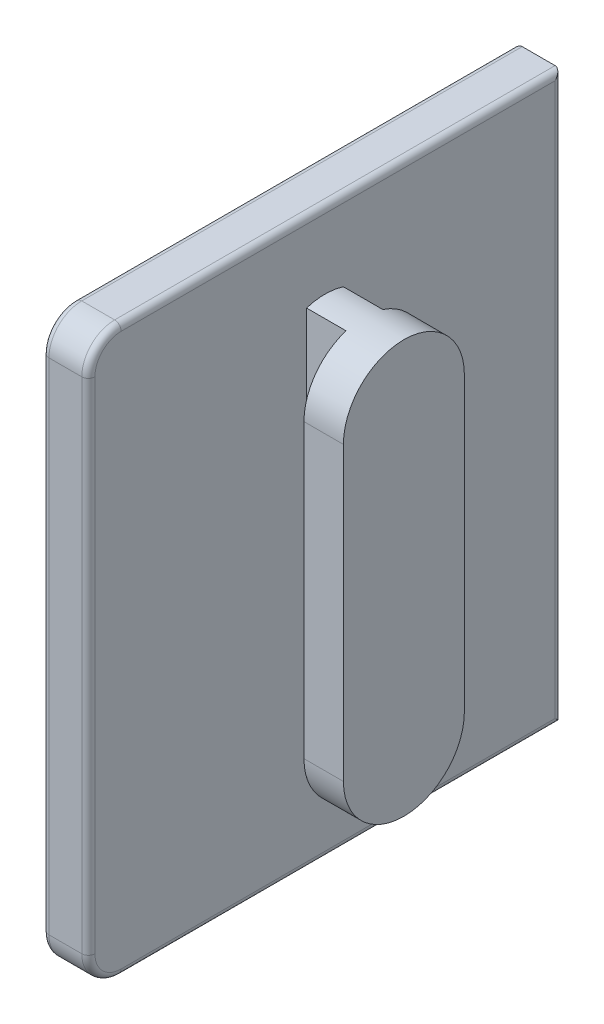
ISO-10303-21;
HEADER;
FILE_DESCRIPTION(('STEP AP214'),'2;1');
FILE_NAME('part.step','',(''),(''),'','','');
FILE_SCHEMA(('AUTOMOTIVE_DESIGN { 1 0 10303 214 1 1 1 1 }'));
ENDSEC;
DATA;
#1=APPLICATION_CONTEXT('core data for automotive mechanical design processes');
#2=APPLICATION_PROTOCOL_DEFINITION('international standard','automotive_design',2000,#1);
#3=PRODUCT_CONTEXT('',#1,'mechanical');
#4=PRODUCT('Part','Part','',(#3));
#5=PRODUCT_RELATED_PRODUCT_CATEGORY('part','',(#4));
#6=PRODUCT_DEFINITION_FORMATION('','',#4);
#7=PRODUCT_DEFINITION_CONTEXT('part definition',#1,'design');
#8=PRODUCT_DEFINITION('design','',#6,#7);
#9=PRODUCT_DEFINITION_SHAPE('','',#8);
#10=(LENGTH_UNIT() NAMED_UNIT(*) SI_UNIT(.MILLI.,.METRE.));
#11=(NAMED_UNIT(*) PLANE_ANGLE_UNIT() SI_UNIT($,.RADIAN.));
#12=(NAMED_UNIT(*) SI_UNIT($,.STERADIAN.) SOLID_ANGLE_UNIT());
#13=UNCERTAINTY_MEASURE_WITH_UNIT(LENGTH_MEASURE(1.E-05),#10,'distance_accuracy_value','');
#14=(GEOMETRIC_REPRESENTATION_CONTEXT(3) GLOBAL_UNCERTAINTY_ASSIGNED_CONTEXT((#13)) GLOBAL_UNIT_ASSIGNED_CONTEXT((#10,
#11,#12)) REPRESENTATION_CONTEXT('',''));
#15=CARTESIAN_POINT('',(0.,0.,0.));
#16=DIRECTION('',(0.,0.,1.));
#17=DIRECTION('',(1.,0.,0.));
#18=AXIS2_PLACEMENT_3D('',#15,#16,#17);
#19=CARTESIAN_POINT('',(3.5,0.,0.));
#20=DIRECTION('',(1.,0.,0.));
#21=DIRECTION('',(0.,0.,-1.));
#22=AXIS2_PLACEMENT_3D('',#19,#20,#21);
#23=PLANE('',#22);
#24=CARTESIAN_POINT('',(3.5,-19.,15.5));
#25=DIRECTION('',(1.,0.,0.));
#26=DIRECTION('',(0.,0.,-1.));
#27=AXIS2_PLACEMENT_3D('',#24,#25,#26);
#28=CIRCLE('',#27,2.);
#29=CARTESIAN_POINT('',(3.5,-19.,17.5));
#30=VERTEX_POINT('',#29);
#31=CARTESIAN_POINT('',(3.5,-21.,15.5));
#32=VERTEX_POINT('',#31);
#33=EDGE_CURVE('E455',#30,#32,#28,.T.);
#34=ORIENTED_EDGE('',*,*,#33,.T.);
#35=DIRECTION('',(0.,0.,-1.));
#36=VECTOR('',#35,1.);
#37=CARTESIAN_POINT('',(3.5,-21.,-18.));
#38=LINE('',#37,#36);
#39=CARTESIAN_POINT('',(3.5,-21.,-17.5));
#40=VERTEX_POINT('',#39);
#41=EDGE_CURVE('E452',#32,#40,#38,.T.);
#42=ORIENTED_EDGE('',*,*,#41,.T.);
#43=DIRECTION('',(0.,1.,0.));
#44=VECTOR('',#43,1.);
#45=CARTESIAN_POINT('',(3.5,21.5,-17.5));
#46=LINE('',#45,#44);
#47=CARTESIAN_POINT('',(3.5,21.,-17.5));
#48=VERTEX_POINT('',#47);
#49=EDGE_CURVE('E461',#40,#48,#46,.T.);
#50=ORIENTED_EDGE('',*,*,#49,.T.);
#51=DIRECTION('',(0.,0.,1.));
#52=VECTOR('',#51,1.);
#53=CARTESIAN_POINT('',(3.5,21.,15.5));
#54=LINE('',#53,#52);
#55=CARTESIAN_POINT('',(3.5,21.,15.5));
#56=VERTEX_POINT('',#55);
#57=EDGE_CURVE('E463',#48,#56,#54,.T.);
#58=ORIENTED_EDGE('',*,*,#57,.T.);
#59=CARTESIAN_POINT('',(3.5,19.,15.5));
#60=DIRECTION('',(1.,0.,0.));
#61=DIRECTION('',(0.,0.,-1.));
#62=AXIS2_PLACEMENT_3D('',#59,#60,#61);
#63=CIRCLE('',#62,2.);
#64=CARTESIAN_POINT('',(3.5,19.,17.5));
#65=VERTEX_POINT('',#64);
#66=EDGE_CURVE('E459',#56,#65,#63,.T.);
#67=ORIENTED_EDGE('',*,*,#66,.T.);
#68=DIRECTION('',(0.,-1.,0.));
#69=VECTOR('',#68,1.);
#70=CARTESIAN_POINT('',(3.5,-19.,17.5));
#71=LINE('',#70,#69);
#72=EDGE_CURVE('E457',#65,#30,#71,.T.);
#73=ORIENTED_EDGE('',*,*,#72,.T.);
#74=EDGE_LOOP('',(#34,#42,#50,#58,#67,#73));
#75=FACE_BOUND('',#74,.T.);
#76=DIRECTION('',(0.,1.,0.));
#77=VECTOR('',#76,1.);
#78=CARTESIAN_POINT('',(3.5,15.4817804600413,-1.4));
#79=LINE('',#78,#77);
#80=CARTESIAN_POINT('',(3.5,-15.4817804600413,-1.4));
#81=VERTEX_POINT('',#80);
#82=CARTESIAN_POINT('',(3.5,15.4817804600413,-1.4));
#83=VERTEX_POINT('',#82);
#84=EDGE_CURVE('E203',#81,#83,#79,.T.);
#85=ORIENTED_EDGE('',*,*,#84,.F.);
#86=CARTESIAN_POINT('',(3.5,-11.1,0.));
#87=DIRECTION('',(1.,0.,0.));
#88=DIRECTION('',(0.,0.,-1.));
#89=AXIS2_PLACEMENT_3D('',#86,#87,#88);
#90=CIRCLE('',#89,4.6);
#91=CARTESIAN_POINT('',(3.5,-15.4817804600413,1.4));
#92=VERTEX_POINT('',#91);
#93=EDGE_CURVE('E201',#92,#81,#90,.T.);
#94=ORIENTED_EDGE('',*,*,#93,.F.);
#95=DIRECTION('',(0.,-1.,0.));
#96=VECTOR('',#95,1.);
#97=CARTESIAN_POINT('',(3.5,15.4817804600413,1.4));
#98=LINE('',#97,#96);
#99=CARTESIAN_POINT('',(3.5,15.4817804600413,1.4));
#100=VERTEX_POINT('',#99);
#101=EDGE_CURVE('E257',#100,#92,#98,.T.);
#102=ORIENTED_EDGE('',*,*,#101,.F.);
#103=CARTESIAN_POINT('',(3.5,11.1,0.));
#104=DIRECTION('',(1.,0.,0.));
#105=DIRECTION('',(0.,0.,-1.));
#106=AXIS2_PLACEMENT_3D('',#103,#104,#105);
#107=CIRCLE('',#106,4.6);
#108=EDGE_CURVE('E260',#83,#100,#107,.T.);
#109=ORIENTED_EDGE('',*,*,#108,.F.);
#110=EDGE_LOOP('',(#85,#94,#102,#109));
#111=FACE_BOUND('',#110,.T.);
#112=ADVANCED_FACE('F36',(#75,#111),#23,.T.);
#113=CARTESIAN_POINT('',(3.5,21.5,-18.));
#114=DIRECTION('',(0.,0.,1.));
#115=DIRECTION('',(0.,-1.,0.));
#116=AXIS2_PLACEMENT_3D('',#113,#114,#115);
#117=PLANE('',#116);
#118=DIRECTION('',(-1.,0.,0.));
#119=VECTOR('',#118,1.);
#120=CARTESIAN_POINT('',(3.5,-21.5,-18.));
#121=LINE('',#120,#119);
#122=CARTESIAN_POINT('',(3.,-21.5,-18.));
#123=VERTEX_POINT('',#122);
#124=CARTESIAN_POINT('',(0.5,-21.5,-18.));
#125=VERTEX_POINT('',#124);
#126=EDGE_CURVE('E282',#123,#125,#121,.T.);
#127=ORIENTED_EDGE('',*,*,#126,.T.);
#128=DIRECTION('',(0.,1.,0.));
#129=VECTOR('',#128,1.);
#130=CARTESIAN_POINT('',(0.5,21.5,-18.));
#131=LINE('',#130,#129);
#132=CARTESIAN_POINT('',(0.5,21.5,-18.));
#133=VERTEX_POINT('',#132);
#134=EDGE_CURVE('E431',#125,#133,#131,.T.);
#135=ORIENTED_EDGE('',*,*,#134,.T.);
#136=DIRECTION('',(-1.,0.,0.));
#137=VECTOR('',#136,1.);
#138=CARTESIAN_POINT('',(3.5,21.5,-18.));
#139=LINE('',#138,#137);
#140=CARTESIAN_POINT('',(3.,21.5,-18.));
#141=VERTEX_POINT('',#140);
#142=EDGE_CURVE('E278',#141,#133,#139,.T.);
#143=ORIENTED_EDGE('',*,*,#142,.F.);
#144=DIRECTION('',(0.,1.,0.));
#145=VECTOR('',#144,1.);
#146=CARTESIAN_POINT('',(3.,-21.5,-18.));
#147=LINE('',#146,#145);
#148=EDGE_CURVE('E434',#141,#123,#147,.F.);
#149=ORIENTED_EDGE('',*,*,#148,.T.);
#150=EDGE_LOOP('',(#127,#135,#143,#149));
#151=FACE_BOUND('',#150,.T.);
#152=ADVANCED_FACE('F301',(#151),#117,.F.);
#153=CARTESIAN_POINT('',(3.5,21.5,18.));
#154=DIRECTION('',(0.,-1.,0.));
#155=DIRECTION('',(0.,0.,-1.));
#156=AXIS2_PLACEMENT_3D('',#153,#154,#155);
#157=PLANE('',#156);
#158=ORIENTED_EDGE('',*,*,#142,.T.);
#159=DIRECTION('',(0.,0.,1.));
#160=VECTOR('',#159,1.);
#161=CARTESIAN_POINT('',(0.5,21.5,18.));
#162=LINE('',#161,#160);
#163=CARTESIAN_POINT('',(0.5,21.5,15.5));
#164=VERTEX_POINT('',#163);
#165=EDGE_CURVE('E11',#133,#164,#162,.T.);
#166=ORIENTED_EDGE('',*,*,#165,.T.);
#167=DIRECTION('',(-1.,0.,0.));
#168=VECTOR('',#167,1.);
#169=CARTESIAN_POINT('',(3.5,21.5,15.5));
#170=LINE('',#169,#168);
#171=CARTESIAN_POINT('',(3.,21.5,15.5));
#172=VERTEX_POINT('',#171);
#173=EDGE_CURVE('E465',#164,#172,#170,.F.);
#174=ORIENTED_EDGE('',*,*,#173,.T.);
#175=DIRECTION('',(0.,0.,1.));
#176=VECTOR('',#175,1.);
#177=CARTESIAN_POINT('',(3.,21.5,-18.));
#178=LINE('',#177,#176);
#179=EDGE_CURVE('E45',#172,#141,#178,.F.);
#180=ORIENTED_EDGE('',*,*,#179,.T.);
#181=EDGE_LOOP('',(#158,#166,#174,#180));
#182=FACE_BOUND('',#181,.T.);
#183=ADVANCED_FACE('F307',(#182),#157,.F.);
#184=CARTESIAN_POINT('',(3.5,21.5,18.));
#185=DIRECTION('',(0.,0.,-1.));
#186=DIRECTION('',(0.,1.,0.));
#187=AXIS2_PLACEMENT_3D('',#184,#185,#186);
#188=PLANE('',#187);
#189=DIRECTION('',(-1.,0.,0.));
#190=VECTOR('',#189,1.);
#191=CARTESIAN_POINT('',(3.5,-19.,18.));
#192=LINE('',#191,#190);
#193=CARTESIAN_POINT('',(0.5,-19.,18.));
#194=VERTEX_POINT('',#193);
#195=CARTESIAN_POINT('',(3.,-19.,18.));
#196=VERTEX_POINT('',#195);
#197=EDGE_CURVE('E468',#194,#196,#192,.F.);
#198=ORIENTED_EDGE('',*,*,#197,.T.);
#199=DIRECTION('',(0.,-1.,0.));
#200=VECTOR('',#199,1.);
#201=CARTESIAN_POINT('',(3.,19.,18.));
#202=LINE('',#201,#200);
#203=CARTESIAN_POINT('',(3.,19.,18.));
#204=VERTEX_POINT('',#203);
#205=EDGE_CURVE('E440',#196,#204,#202,.F.);
#206=ORIENTED_EDGE('',*,*,#205,.T.);
#207=DIRECTION('',(-1.,0.,0.));
#208=VECTOR('',#207,1.);
#209=CARTESIAN_POINT('',(3.5,19.,18.));
#210=LINE('',#209,#208);
#211=CARTESIAN_POINT('',(0.5,19.,18.));
#212=VERTEX_POINT('',#211);
#213=EDGE_CURVE('E471',#204,#212,#210,.T.);
#214=ORIENTED_EDGE('',*,*,#213,.T.);
#215=DIRECTION('',(0.,-1.,0.));
#216=VECTOR('',#215,1.);
#217=CARTESIAN_POINT('',(0.5,21.5,18.));
#218=LINE('',#217,#216);
#219=EDGE_CURVE('E442',#212,#194,#218,.T.);
#220=ORIENTED_EDGE('',*,*,#219,.T.);
#221=EDGE_LOOP('',(#198,#206,#214,#220));
#222=FACE_BOUND('',#221,.T.);
#223=ADVANCED_FACE('F319',(#222),#188,.F.);
#224=CARTESIAN_POINT('',(3.5,-21.5,18.));
#225=DIRECTION('',(0.,1.,0.));
#226=DIRECTION('',(0.,0.,1.));
#227=AXIS2_PLACEMENT_3D('',#224,#225,#226);
#228=PLANE('',#227);
#229=ORIENTED_EDGE('',*,*,#126,.F.);
#230=DIRECTION('',(0.,0.,-1.));
#231=VECTOR('',#230,1.);
#232=CARTESIAN_POINT('',(3.,-21.5,15.5));
#233=LINE('',#232,#231);
#234=CARTESIAN_POINT('',(3.,-21.5,15.5));
#235=VERTEX_POINT('',#234);
#236=EDGE_CURVE('E447',#123,#235,#233,.F.);
#237=ORIENTED_EDGE('',*,*,#236,.T.);
#238=DIRECTION('',(-1.,0.,0.));
#239=VECTOR('',#238,1.);
#240=CARTESIAN_POINT('',(3.5,-21.5,15.5));
#241=LINE('',#240,#239);
#242=CARTESIAN_POINT('',(0.5,-21.5,15.5));
#243=VERTEX_POINT('',#242);
#244=EDGE_CURVE('E281',#235,#243,#241,.T.);
#245=ORIENTED_EDGE('',*,*,#244,.T.);
#246=DIRECTION('',(0.,0.,-1.));
#247=VECTOR('',#246,1.);
#248=CARTESIAN_POINT('',(0.5,-21.5,18.));
#249=LINE('',#248,#247);
#250=EDGE_CURVE('E450',#243,#125,#249,.T.);
#251=ORIENTED_EDGE('',*,*,#250,.T.);
#252=EDGE_LOOP('',(#229,#237,#245,#251));
#253=FACE_BOUND('',#252,.T.);
#254=ADVANCED_FACE('F316',(#253),#228,.F.);
#255=CARTESIAN_POINT('',(0.,0.,0.));
#256=DIRECTION('',(1.,0.,0.));
#257=DIRECTION('',(0.,0.,-1.));
#258=AXIS2_PLACEMENT_3D('',#255,#256,#257);
#259=PLANE('',#258);
#260=DIRECTION('',(0.,0.,1.));
#261=VECTOR('',#260,1.);
#262=CARTESIAN_POINT('',(0.,21.,0.));
#263=LINE('',#262,#261);
#264=CARTESIAN_POINT('',(0.,21.,15.5));
#265=VERTEX_POINT('',#264);
#266=CARTESIAN_POINT('',(0.,21.,-17.5));
#267=VERTEX_POINT('',#266);
#268=EDGE_CURVE('E53',#265,#267,#263,.F.);
#269=ORIENTED_EDGE('',*,*,#268,.T.);
#270=DIRECTION('',(0.,1.,0.));
#271=VECTOR('',#270,1.);
#272=CARTESIAN_POINT('',(0.,0.,-17.5));
#273=LINE('',#272,#271);
#274=CARTESIAN_POINT('',(0.,-21.,-17.5));
#275=VERTEX_POINT('',#274);
#276=EDGE_CURVE('E422',#267,#275,#273,.F.);
#277=ORIENTED_EDGE('',*,*,#276,.T.);
#278=DIRECTION('',(0.,0.,-1.));
#279=VECTOR('',#278,1.);
#280=CARTESIAN_POINT('',(0.,-21.,0.));
#281=LINE('',#280,#279);
#282=CARTESIAN_POINT('',(0.,-21.,15.5));
#283=VERTEX_POINT('',#282);
#284=EDGE_CURVE('E429',#275,#283,#281,.F.);
#285=ORIENTED_EDGE('',*,*,#284,.T.);
#286=CARTESIAN_POINT('',(0.,-19.,15.5));
#287=DIRECTION('',(1.,0.,0.));
#288=DIRECTION('',(0.,0.,-1.));
#289=AXIS2_PLACEMENT_3D('',#286,#287,#288);
#290=CIRCLE('',#289,2.);
#291=CARTESIAN_POINT('',(0.,-19.,17.5));
#292=VERTEX_POINT('',#291);
#293=EDGE_CURVE('E386',#283,#292,#290,.F.);
#294=ORIENTED_EDGE('',*,*,#293,.T.);
#295=DIRECTION('',(0.,-1.,0.));
#296=VECTOR('',#295,1.);
#297=CARTESIAN_POINT('',(0.,0.,17.5));
#298=LINE('',#297,#296);
#299=CARTESIAN_POINT('',(0.,19.,17.5));
#300=VERTEX_POINT('',#299);
#301=EDGE_CURVE('E426',#292,#300,#298,.F.);
#302=ORIENTED_EDGE('',*,*,#301,.T.);
#303=CARTESIAN_POINT('',(0.,19.,15.5));
#304=DIRECTION('',(1.,0.,0.));
#305=DIRECTION('',(0.,0.,-1.));
#306=AXIS2_PLACEMENT_3D('',#303,#304,#305);
#307=CIRCLE('',#306,2.);
#308=EDGE_CURVE('E58',#300,#265,#307,.F.);
#309=ORIENTED_EDGE('',*,*,#308,.T.);
#310=EDGE_LOOP('',(#269,#277,#285,#294,#302,#309));
#311=FACE_BOUND('',#310,.T.);
#312=ADVANCED_FACE('F313',(#311),#259,.F.);
#313=CARTESIAN_POINT('',(6.5,-11.1,0.));
#314=DIRECTION('',(-1.,0.,0.));
#315=DIRECTION('',(0.,0.,1.));
#316=AXIS2_PLACEMENT_3D('',#313,#314,#315);
#317=CYLINDRICAL_SURFACE('',#316,4.6);
#318=ORIENTED_EDGE('',*,*,#93,.T.);
#319=DIRECTION('',(-1.,0.,0.));
#320=VECTOR('',#319,1.);
#321=CARTESIAN_POINT('',(6.5,-15.4817804600413,-1.4));
#322=LINE('',#321,#320);
#323=CARTESIAN_POINT('',(6.5,-15.4817804600413,-1.4));
#324=VERTEX_POINT('',#323);
#325=EDGE_CURVE('E276',#324,#81,#322,.T.);
#326=ORIENTED_EDGE('',*,*,#325,.F.);
#327=CARTESIAN_POINT('',(6.5,-11.1,0.));
#328=DIRECTION('',(1.,0.,0.));
#329=DIRECTION('',(0.,0.,-1.));
#330=AXIS2_PLACEMENT_3D('',#327,#328,#329);
#331=CIRCLE('',#330,4.6);
#332=CARTESIAN_POINT('',(6.5,-11.1,-4.6));
#333=VERTEX_POINT('',#332);
#334=EDGE_CURVE('E199',#324,#333,#331,.T.);
#335=ORIENTED_EDGE('',*,*,#334,.T.);
#336=DIRECTION('',(-1.,0.,0.));
#337=VECTOR('',#336,1.);
#338=CARTESIAN_POINT('',(9.5,-11.1,-4.6));
#339=LINE('',#338,#337);
#340=CARTESIAN_POINT('',(9.5,-11.1,-4.6));
#341=VERTEX_POINT('',#340);
#342=EDGE_CURVE('E178',#341,#333,#339,.T.);
#343=ORIENTED_EDGE('',*,*,#342,.F.);
#344=CARTESIAN_POINT('',(9.5,-11.1,0.));
#345=DIRECTION('',(1.,0.,0.));
#346=DIRECTION('',(0.,0.,-1.));
#347=AXIS2_PLACEMENT_3D('',#344,#345,#346);
#348=CIRCLE('',#347,4.6);
#349=CARTESIAN_POINT('',(9.5,-11.1,4.59999999999999));
#350=VERTEX_POINT('',#349);
#351=EDGE_CURVE('E184',#350,#341,#348,.T.);
#352=ORIENTED_EDGE('',*,*,#351,.F.);
#353=DIRECTION('',(-1.,0.,0.));
#354=VECTOR('',#353,1.);
#355=CARTESIAN_POINT('',(9.5,-11.1,4.59999999999999));
#356=LINE('',#355,#354);
#357=CARTESIAN_POINT('',(6.5,-11.1,4.59999999999999));
#358=VERTEX_POINT('',#357);
#359=EDGE_CURVE('E245',#350,#358,#356,.T.);
#360=ORIENTED_EDGE('',*,*,#359,.T.);
#361=CARTESIAN_POINT('',(6.5,-15.4817804600413,1.4));
#362=VERTEX_POINT('',#361);
#363=EDGE_CURVE('E209',#358,#362,#331,.T.);
#364=ORIENTED_EDGE('',*,*,#363,.T.);
#365=DIRECTION('',(-1.,0.,0.));
#366=VECTOR('',#365,1.);
#367=CARTESIAN_POINT('',(6.5,-15.4817804600413,1.4));
#368=LINE('',#367,#366);
#369=EDGE_CURVE('E250',#362,#92,#368,.T.);
#370=ORIENTED_EDGE('',*,*,#369,.T.);
#371=EDGE_LOOP('',(#318,#326,#335,#343,#352,#360,#364,#370));
#372=FACE_BOUND('',#371,.T.);
#373=ADVANCED_FACE('F196',(#372),#317,.T.);
#374=CARTESIAN_POINT('',(6.5,15.4817804600413,-1.4));
#375=DIRECTION('',(0.,0.,1.));
#376=DIRECTION('',(0.,-1.,0.));
#377=AXIS2_PLACEMENT_3D('',#374,#375,#376);
#378=PLANE('',#377);
#379=ORIENTED_EDGE('',*,*,#84,.T.);
#380=DIRECTION('',(-1.,0.,0.));
#381=VECTOR('',#380,1.);
#382=CARTESIAN_POINT('',(6.5,15.4817804600413,-1.4));
#383=LINE('',#382,#381);
#384=CARTESIAN_POINT('',(6.5,15.4817804600413,-1.4));
#385=VERTEX_POINT('',#384);
#386=EDGE_CURVE('E266',#385,#83,#383,.T.);
#387=ORIENTED_EDGE('',*,*,#386,.F.);
#388=DIRECTION('',(0.,1.,0.));
#389=VECTOR('',#388,1.);
#390=CARTESIAN_POINT('',(6.5,15.4817804600413,-1.4));
#391=LINE('',#390,#389);
#392=EDGE_CURVE('E255',#324,#385,#391,.T.);
#393=ORIENTED_EDGE('',*,*,#392,.F.);
#394=ORIENTED_EDGE('',*,*,#325,.T.);
#395=EDGE_LOOP('',(#379,#387,#393,#394));
#396=FACE_BOUND('',#395,.T.);
#397=ADVANCED_FACE('F286',(#396),#378,.F.);
#398=CARTESIAN_POINT('',(6.5,11.1,0.));
#399=DIRECTION('',(-1.,0.,0.));
#400=DIRECTION('',(0.,0.,1.));
#401=AXIS2_PLACEMENT_3D('',#398,#399,#400);
#402=CYLINDRICAL_SURFACE('',#401,4.6);
#403=ORIENTED_EDGE('',*,*,#108,.T.);
#404=DIRECTION('',(-1.,0.,0.));
#405=VECTOR('',#404,1.);
#406=CARTESIAN_POINT('',(6.5,15.4817804600413,1.4));
#407=LINE('',#406,#405);
#408=CARTESIAN_POINT('',(6.5,15.4817804600413,1.4));
#409=VERTEX_POINT('',#408);
#410=EDGE_CURVE('E238',#409,#100,#407,.T.);
#411=ORIENTED_EDGE('',*,*,#410,.F.);
#412=CARTESIAN_POINT('',(6.5,11.1,0.));
#413=DIRECTION('',(1.,0.,0.));
#414=DIRECTION('',(0.,0.,-1.));
#415=AXIS2_PLACEMENT_3D('',#412,#413,#414);
#416=CIRCLE('',#415,4.6);
#417=CARTESIAN_POINT('',(6.5,11.1,4.6));
#418=VERTEX_POINT('',#417);
#419=EDGE_CURVE('E221',#409,#418,#416,.T.);
#420=ORIENTED_EDGE('',*,*,#419,.T.);
#421=DIRECTION('',(-1.,0.,0.));
#422=VECTOR('',#421,1.);
#423=CARTESIAN_POINT('',(9.5,11.1,4.6));
#424=LINE('',#423,#422);
#425=CARTESIAN_POINT('',(9.5,11.1,4.6));
#426=VERTEX_POINT('',#425);
#427=EDGE_CURVE('E205',#426,#418,#424,.T.);
#428=ORIENTED_EDGE('',*,*,#427,.F.);
#429=CARTESIAN_POINT('',(9.5,11.1,0.));
#430=DIRECTION('',(1.,0.,0.));
#431=DIRECTION('',(0.,0.,-1.));
#432=AXIS2_PLACEMENT_3D('',#429,#430,#431);
#433=CIRCLE('',#432,4.6);
#434=CARTESIAN_POINT('',(9.5,11.1,-4.6));
#435=VERTEX_POINT('',#434);
#436=EDGE_CURVE('E183',#435,#426,#433,.T.);
#437=ORIENTED_EDGE('',*,*,#436,.F.);
#438=DIRECTION('',(-1.,0.,0.));
#439=VECTOR('',#438,1.);
#440=CARTESIAN_POINT('',(9.5,11.1,-4.6));
#441=LINE('',#440,#439);
#442=CARTESIAN_POINT('',(6.5,11.1,-4.6));
#443=VERTEX_POINT('',#442);
#444=EDGE_CURVE('E180',#435,#443,#441,.T.);
#445=ORIENTED_EDGE('',*,*,#444,.T.);
#446=EDGE_CURVE('E228',#443,#385,#416,.T.);
#447=ORIENTED_EDGE('',*,*,#446,.T.);
#448=ORIENTED_EDGE('',*,*,#386,.T.);
#449=EDGE_LOOP('',(#403,#411,#420,#428,#437,#445,#447,#448));
#450=FACE_BOUND('',#449,.T.);
#451=ADVANCED_FACE('F237',(#450),#402,.T.);
#452=CARTESIAN_POINT('',(6.5,15.4817804600413,1.4));
#453=DIRECTION('',(0.,0.,-1.));
#454=DIRECTION('',(0.,1.,0.));
#455=AXIS2_PLACEMENT_3D('',#452,#453,#454);
#456=PLANE('',#455);
#457=ORIENTED_EDGE('',*,*,#101,.T.);
#458=ORIENTED_EDGE('',*,*,#369,.F.);
#459=DIRECTION('',(0.,-1.,0.));
#460=VECTOR('',#459,1.);
#461=CARTESIAN_POINT('',(6.5,15.4817804600413,1.4));
#462=LINE('',#461,#460);
#463=EDGE_CURVE('E248',#409,#362,#462,.T.);
#464=ORIENTED_EDGE('',*,*,#463,.F.);
#465=ORIENTED_EDGE('',*,*,#410,.T.);
#466=EDGE_LOOP('',(#457,#458,#464,#465));
#467=FACE_BOUND('',#466,.T.);
#468=ADVANCED_FACE('F290',(#467),#456,.F.);
#469=CARTESIAN_POINT('',(6.5,-11.1,0.));
#470=DIRECTION('',(1.,0.,0.));
#471=DIRECTION('',(0.,0.,-1.));
#472=AXIS2_PLACEMENT_3D('',#469,#470,#471);
#473=PLANE('',#472);
#474=ORIENTED_EDGE('',*,*,#334,.F.);
#475=ORIENTED_EDGE('',*,*,#392,.T.);
#476=ORIENTED_EDGE('',*,*,#446,.F.);
#477=DIRECTION('',(0.,1.,0.));
#478=VECTOR('',#477,1.);
#479=CARTESIAN_POINT('',(6.5,11.1,-4.6));
#480=LINE('',#479,#478);
#481=EDGE_CURVE('E213',#333,#443,#480,.T.);
#482=ORIENTED_EDGE('',*,*,#481,.F.);
#483=EDGE_LOOP('',(#474,#475,#476,#482));
#484=FACE_BOUND('',#483,.T.);
#485=ADVANCED_FACE('F254',(#484),#473,.F.);
#486=ORIENTED_EDGE('',*,*,#419,.F.);
#487=ORIENTED_EDGE('',*,*,#463,.T.);
#488=ORIENTED_EDGE('',*,*,#363,.F.);
#489=DIRECTION('',(0.,-1.,0.));
#490=VECTOR('',#489,1.);
#491=CARTESIAN_POINT('',(6.5,-11.1,4.59999999999999));
#492=LINE('',#491,#490);
#493=EDGE_CURVE('E193',#418,#358,#492,.T.);
#494=ORIENTED_EDGE('',*,*,#493,.F.);
#495=EDGE_LOOP('',(#486,#487,#488,#494));
#496=FACE_BOUND('',#495,.T.);
#497=ADVANCED_FACE('F247',(#496),#473,.F.);
#498=CARTESIAN_POINT('',(9.5,11.1,-4.6));
#499=DIRECTION('',(0.,0.,1.));
#500=DIRECTION('',(0.,-1.,0.));
#501=AXIS2_PLACEMENT_3D('',#498,#499,#500);
#502=PLANE('',#501);
#503=ORIENTED_EDGE('',*,*,#481,.T.);
#504=ORIENTED_EDGE('',*,*,#444,.F.);
#505=DIRECTION('',(0.,1.,0.));
#506=VECTOR('',#505,1.);
#507=CARTESIAN_POINT('',(9.5,11.1,-4.6));
#508=LINE('',#507,#506);
#509=EDGE_CURVE('E174',#341,#435,#508,.T.);
#510=ORIENTED_EDGE('',*,*,#509,.F.);
#511=ORIENTED_EDGE('',*,*,#342,.T.);
#512=EDGE_LOOP('',(#503,#504,#510,#511));
#513=FACE_BOUND('',#512,.T.);
#514=ADVANCED_FACE('F176',(#513),#502,.F.);
#515=CARTESIAN_POINT('',(9.5,-11.1,4.59999999999999));
#516=DIRECTION('',(0.,0.,-1.));
#517=DIRECTION('',(0.,1.,0.));
#518=AXIS2_PLACEMENT_3D('',#515,#516,#517);
#519=PLANE('',#518);
#520=ORIENTED_EDGE('',*,*,#493,.T.);
#521=ORIENTED_EDGE('',*,*,#359,.F.);
#522=DIRECTION('',(0.,-1.,0.));
#523=VECTOR('',#522,1.);
#524=CARTESIAN_POINT('',(9.5,-11.1,4.59999999999999));
#525=LINE('',#524,#523);
#526=EDGE_CURVE('E189',#426,#350,#525,.T.);
#527=ORIENTED_EDGE('',*,*,#526,.F.);
#528=ORIENTED_EDGE('',*,*,#427,.T.);
#529=EDGE_LOOP('',(#520,#521,#527,#528));
#530=FACE_BOUND('',#529,.T.);
#531=ADVANCED_FACE('F244',(#530),#519,.F.);
#532=CARTESIAN_POINT('',(9.5,-11.1,0.));
#533=DIRECTION('',(1.,0.,0.));
#534=DIRECTION('',(0.,0.,-1.));
#535=AXIS2_PLACEMENT_3D('',#532,#533,#534);
#536=PLANE('',#535);
#537=ORIENTED_EDGE('',*,*,#351,.T.);
#538=ORIENTED_EDGE('',*,*,#509,.T.);
#539=ORIENTED_EDGE('',*,*,#436,.T.);
#540=ORIENTED_EDGE('',*,*,#526,.T.);
#541=EDGE_LOOP('',(#537,#538,#539,#540));
#542=FACE_BOUND('',#541,.T.);
#543=ADVANCED_FACE('F187',(#542),#536,.T.);
#544=CARTESIAN_POINT('',(3.5,-19.,15.5));
#545=DIRECTION('',(-1.,0.,0.));
#546=DIRECTION('',(0.,0.,1.));
#547=AXIS2_PLACEMENT_3D('',#544,#545,#546);
#548=CYLINDRICAL_SURFACE('',#547,2.5);
#549=ORIENTED_EDGE('',*,*,#244,.F.);
#550=CARTESIAN_POINT('',(3.,-19.,15.5));
#551=DIRECTION('',(1.,0.,0.));
#552=DIRECTION('',(0.,0.,-1.));
#553=AXIS2_PLACEMENT_3D('',#550,#551,#552);
#554=CIRCLE('',#553,2.5);
#555=EDGE_CURVE('E444',#235,#196,#554,.F.);
#556=ORIENTED_EDGE('',*,*,#555,.T.);
#557=ORIENTED_EDGE('',*,*,#197,.F.);
#558=CARTESIAN_POINT('',(0.5,-19.,15.5));
#559=DIRECTION('',(1.,0.,0.));
#560=DIRECTION('',(0.,0.,-1.));
#561=AXIS2_PLACEMENT_3D('',#558,#559,#560);
#562=CIRCLE('',#561,2.5);
#563=EDGE_CURVE('E388',#194,#243,#562,.T.);
#564=ORIENTED_EDGE('',*,*,#563,.T.);
#565=EDGE_LOOP('',(#549,#556,#557,#564));
#566=FACE_BOUND('',#565,.T.);
#567=ADVANCED_FACE('F327',(#566),#548,.T.);
#568=CARTESIAN_POINT('',(3.5,19.,15.5));
#569=DIRECTION('',(-1.,0.,0.));
#570=DIRECTION('',(0.,0.,1.));
#571=AXIS2_PLACEMENT_3D('',#568,#569,#570);
#572=CYLINDRICAL_SURFACE('',#571,2.5);
#573=ORIENTED_EDGE('',*,*,#213,.F.);
#574=CARTESIAN_POINT('',(3.,19.,15.5));
#575=DIRECTION('',(1.,0.,0.));
#576=DIRECTION('',(0.,0.,-1.));
#577=AXIS2_PLACEMENT_3D('',#574,#575,#576);
#578=CIRCLE('',#577,2.5);
#579=EDGE_CURVE('E436',#204,#172,#578,.F.);
#580=ORIENTED_EDGE('',*,*,#579,.T.);
#581=ORIENTED_EDGE('',*,*,#173,.F.);
#582=CARTESIAN_POINT('',(0.5,19.,15.5));
#583=DIRECTION('',(1.,0.,0.));
#584=DIRECTION('',(0.,0.,-1.));
#585=AXIS2_PLACEMENT_3D('',#582,#583,#584);
#586=CIRCLE('',#585,2.5);
#587=EDGE_CURVE('E438',#164,#212,#586,.T.);
#588=ORIENTED_EDGE('',*,*,#587,.T.);
#589=EDGE_LOOP('',(#573,#580,#581,#588));
#590=FACE_BOUND('',#589,.T.);
#591=ADVANCED_FACE('F330',(#590),#572,.T.);
#592=CARTESIAN_POINT('',(3.,19.,15.5));
#593=DIRECTION('',(1.,0.,0.));
#594=DIRECTION('',(0.,0.,-1.));
#595=AXIS2_PLACEMENT_3D('',#592,#593,#594);
#596=TOROIDAL_SURFACE('',#595,2.,0.5);
#597=CARTESIAN_POINT('',(3.,21.,15.5));
#598=DIRECTION('',(0.,0.,-1.));
#599=DIRECTION('',(-1.,0.,0.));
#600=AXIS2_PLACEMENT_3D('',#597,#598,#599);
#601=CIRCLE('',#600,0.5);
#602=EDGE_CURVE('E411',#172,#56,#601,.T.);
#603=ORIENTED_EDGE('',*,*,#602,.F.);
#604=ORIENTED_EDGE('',*,*,#579,.F.);
#605=CARTESIAN_POINT('',(3.,19.,17.5));
#606=DIRECTION('',(0.,-1.,0.));
#607=DIRECTION('',(0.,0.,-1.));
#608=AXIS2_PLACEMENT_3D('',#605,#606,#607);
#609=CIRCLE('',#608,0.5);
#610=EDGE_CURVE('E408',#65,#204,#609,.T.);
#611=ORIENTED_EDGE('',*,*,#610,.F.);
#612=ORIENTED_EDGE('',*,*,#66,.F.);
#613=EDGE_LOOP('',(#603,#604,#611,#612));
#614=FACE_BOUND('',#613,.T.);
#615=ADVANCED_FACE('F334',(#614),#596,.T.);
#616=CARTESIAN_POINT('',(3.,0.,17.5));
#617=DIRECTION('',(0.,1.,0.));
#618=DIRECTION('',(0.,0.,1.));
#619=AXIS2_PLACEMENT_3D('',#616,#617,#618);
#620=CYLINDRICAL_SURFACE('',#619,0.5);
#621=ORIENTED_EDGE('',*,*,#610,.T.);
#622=ORIENTED_EDGE('',*,*,#205,.F.);
#623=CARTESIAN_POINT('',(3.,-19.,17.5));
#624=DIRECTION('',(0.,-1.,0.));
#625=DIRECTION('',(0.,0.,-1.));
#626=AXIS2_PLACEMENT_3D('',#623,#624,#625);
#627=CIRCLE('',#626,0.5);
#628=EDGE_CURVE('E414',#30,#196,#627,.T.);
#629=ORIENTED_EDGE('',*,*,#628,.F.);
#630=ORIENTED_EDGE('',*,*,#72,.F.);
#631=EDGE_LOOP('',(#621,#622,#629,#630));
#632=FACE_BOUND('',#631,.T.);
#633=ADVANCED_FACE('F351',(#632),#620,.T.);
#634=CARTESIAN_POINT('',(3.,21.,0.));
#635=DIRECTION('',(0.,0.,-1.));
#636=DIRECTION('',(-1.,0.,0.));
#637=AXIS2_PLACEMENT_3D('',#634,#635,#636);
#638=CYLINDRICAL_SURFACE('',#637,0.5);
#639=ORIENTED_EDGE('',*,*,#602,.T.);
#640=ORIENTED_EDGE('',*,*,#57,.F.);
#641=CARTESIAN_POINT('',(3.,21.,-17.5));
#642=DIRECTION('',(0.,-0.707106781186547,-0.707106781186548));
#643=DIRECTION('',(0.,0.707106781186548,-0.707106781186547));
#644=AXIS2_PLACEMENT_3D('',#641,#642,#643);
#645=ELLIPSE('',#644,0.707106781186547,0.5);
#646=EDGE_CURVE('E417',#141,#48,#645,.T.);
#647=ORIENTED_EDGE('',*,*,#646,.F.);
#648=ORIENTED_EDGE('',*,*,#179,.F.);
#649=EDGE_LOOP('',(#639,#640,#647,#648));
#650=FACE_BOUND('',#649,.T.);
#651=ADVANCED_FACE('F347',(#650),#638,.T.);
#652=CARTESIAN_POINT('',(3.,-19.,15.5));
#653=DIRECTION('',(1.,0.,0.));
#654=DIRECTION('',(0.,0.,-1.));
#655=AXIS2_PLACEMENT_3D('',#652,#653,#654);
#656=TOROIDAL_SURFACE('',#655,2.,0.5);
#657=ORIENTED_EDGE('',*,*,#628,.T.);
#658=ORIENTED_EDGE('',*,*,#555,.F.);
#659=CARTESIAN_POINT('',(3.,-21.,15.5));
#660=DIRECTION('',(0.,0.,-1.));
#661=DIRECTION('',(-1.,0.,0.));
#662=AXIS2_PLACEMENT_3D('',#659,#660,#661);
#663=CIRCLE('',#662,0.5);
#664=EDGE_CURVE('E393',#32,#235,#663,.T.);
#665=ORIENTED_EDGE('',*,*,#664,.F.);
#666=ORIENTED_EDGE('',*,*,#33,.F.);
#667=EDGE_LOOP('',(#657,#658,#665,#666));
#668=FACE_BOUND('',#667,.T.);
#669=ADVANCED_FACE('F343',(#668),#656,.T.);
#670=CARTESIAN_POINT('',(3.,0.,-17.5));
#671=DIRECTION('',(0.,-1.,0.));
#672=DIRECTION('',(0.,0.,-1.));
#673=AXIS2_PLACEMENT_3D('',#670,#671,#672);
#674=CYLINDRICAL_SURFACE('',#673,0.5);
#675=ORIENTED_EDGE('',*,*,#646,.T.);
#676=ORIENTED_EDGE('',*,*,#49,.F.);
#677=CARTESIAN_POINT('',(3.,-21.,-17.5));
#678=DIRECTION('',(0.,-0.707106781186548,0.707106781186547));
#679=DIRECTION('',(0.,-0.707106781186547,-0.707106781186548));
#680=AXIS2_PLACEMENT_3D('',#677,#678,#679);
#681=ELLIPSE('',#680,0.707106781186548,0.5);
#682=EDGE_CURVE('E391',#123,#40,#681,.T.);
#683=ORIENTED_EDGE('',*,*,#682,.F.);
#684=ORIENTED_EDGE('',*,*,#148,.F.);
#685=EDGE_LOOP('',(#675,#676,#683,#684));
#686=FACE_BOUND('',#685,.T.);
#687=ADVANCED_FACE('F339',(#686),#674,.T.);
#688=CARTESIAN_POINT('',(3.,-21.,0.));
#689=DIRECTION('',(0.,0.,1.));
#690=DIRECTION('',(1.,0.,0.));
#691=AXIS2_PLACEMENT_3D('',#688,#689,#690);
#692=CYLINDRICAL_SURFACE('',#691,0.5);
#693=ORIENTED_EDGE('',*,*,#664,.T.);
#694=ORIENTED_EDGE('',*,*,#236,.F.);
#695=ORIENTED_EDGE('',*,*,#682,.T.);
#696=ORIENTED_EDGE('',*,*,#41,.F.);
#697=EDGE_LOOP('',(#693,#694,#695,#696));
#698=FACE_BOUND('',#697,.T.);
#699=ADVANCED_FACE('F336',(#698),#692,.T.);
#700=CARTESIAN_POINT('',(0.5,21.5,17.5));
#701=DIRECTION('',(0.,-1.,0.));
#702=DIRECTION('',(0.,0.,-1.));
#703=AXIS2_PLACEMENT_3D('',#700,#701,#702);
#704=CYLINDRICAL_SURFACE('',#703,0.5);
#705=CARTESIAN_POINT('',(0.5,19.,17.5));
#706=DIRECTION('',(0.,1.,0.));
#707=DIRECTION('',(0.,0.,1.));
#708=AXIS2_PLACEMENT_3D('',#705,#706,#707);
#709=CIRCLE('',#708,0.5);
#710=EDGE_CURVE('E392',#300,#212,#709,.T.);
#711=ORIENTED_EDGE('',*,*,#710,.F.);
#712=ORIENTED_EDGE('',*,*,#301,.F.);
#713=CARTESIAN_POINT('',(0.5,-19.,17.5));
#714=DIRECTION('',(0.,-1.,0.));
#715=DIRECTION('',(0.,0.,-1.));
#716=AXIS2_PLACEMENT_3D('',#713,#714,#715);
#717=CIRCLE('',#716,0.5);
#718=EDGE_CURVE('E40',#194,#292,#717,.T.);
#719=ORIENTED_EDGE('',*,*,#718,.F.);
#720=ORIENTED_EDGE('',*,*,#219,.F.);
#721=EDGE_LOOP('',(#711,#712,#719,#720));
#722=FACE_BOUND('',#721,.T.);
#723=ADVANCED_FACE('F38',(#722),#704,.T.);
#724=CARTESIAN_POINT('',(0.5,-19.,15.5));
#725=DIRECTION('',(1.,0.,0.));
#726=DIRECTION('',(0.,0.,-1.));
#727=AXIS2_PLACEMENT_3D('',#724,#725,#726);
#728=TOROIDAL_SURFACE('',#727,2.,0.5);
#729=ORIENTED_EDGE('',*,*,#718,.T.);
#730=ORIENTED_EDGE('',*,*,#293,.F.);
#731=CARTESIAN_POINT('',(0.5,-21.,15.5));
#732=DIRECTION('',(0.,0.,-1.));
#733=DIRECTION('',(-1.,0.,0.));
#734=AXIS2_PLACEMENT_3D('',#731,#732,#733);
#735=CIRCLE('',#734,0.5);
#736=EDGE_CURVE('E396',#243,#283,#735,.T.);
#737=ORIENTED_EDGE('',*,*,#736,.F.);
#738=ORIENTED_EDGE('',*,*,#563,.F.);
#739=EDGE_LOOP('',(#729,#730,#737,#738));
#740=FACE_BOUND('',#739,.T.);
#741=ADVANCED_FACE('F373',(#740),#728,.T.);
#742=CARTESIAN_POINT('',(0.5,19.,15.5));
#743=DIRECTION('',(1.,0.,0.));
#744=DIRECTION('',(0.,0.,-1.));
#745=AXIS2_PLACEMENT_3D('',#742,#743,#744);
#746=TOROIDAL_SURFACE('',#745,2.,0.5);
#747=ORIENTED_EDGE('',*,*,#710,.T.);
#748=ORIENTED_EDGE('',*,*,#587,.F.);
#749=CARTESIAN_POINT('',(0.5,21.,15.5));
#750=DIRECTION('',(0.,0.,-1.));
#751=DIRECTION('',(-1.,0.,0.));
#752=AXIS2_PLACEMENT_3D('',#749,#750,#751);
#753=CIRCLE('',#752,0.5);
#754=EDGE_CURVE('E399',#265,#164,#753,.T.);
#755=ORIENTED_EDGE('',*,*,#754,.F.);
#756=ORIENTED_EDGE('',*,*,#308,.F.);
#757=EDGE_LOOP('',(#747,#748,#755,#756));
#758=FACE_BOUND('',#757,.T.);
#759=ADVANCED_FACE('F370',(#758),#746,.T.);
#760=CARTESIAN_POINT('',(0.5,-21.,18.));
#761=DIRECTION('',(0.,0.,-1.));
#762=DIRECTION('',(-1.,0.,0.));
#763=AXIS2_PLACEMENT_3D('',#760,#761,#762);
#764=CYLINDRICAL_SURFACE('',#763,0.5);
#765=ORIENTED_EDGE('',*,*,#736,.T.);
#766=ORIENTED_EDGE('',*,*,#284,.F.);
#767=CARTESIAN_POINT('',(0.5,-21.,-17.5));
#768=DIRECTION('',(0.,0.707106781186548,-0.707106781186547));
#769=DIRECTION('',(0.,-0.707106781186547,-0.707106781186548));
#770=AXIS2_PLACEMENT_3D('',#767,#768,#769);
#771=ELLIPSE('',#770,0.707106781186548,0.5);
#772=EDGE_CURVE('E404',#125,#275,#771,.T.);
#773=ORIENTED_EDGE('',*,*,#772,.F.);
#774=ORIENTED_EDGE('',*,*,#250,.F.);
#775=EDGE_LOOP('',(#765,#766,#773,#774));
#776=FACE_BOUND('',#775,.T.);
#777=ADVANCED_FACE('F366',(#776),#764,.T.);
#778=CARTESIAN_POINT('',(0.5,21.,18.));
#779=DIRECTION('',(0.,0.,1.));
#780=DIRECTION('',(1.,0.,0.));
#781=AXIS2_PLACEMENT_3D('',#778,#779,#780);
#782=CYLINDRICAL_SURFACE('',#781,0.5);
#783=ORIENTED_EDGE('',*,*,#754,.T.);
#784=ORIENTED_EDGE('',*,*,#165,.F.);
#785=CARTESIAN_POINT('',(0.5,21.,-17.5));
#786=DIRECTION('',(0.,0.707106781186547,0.707106781186548));
#787=DIRECTION('',(0.,-0.707106781186548,0.707106781186547));
#788=AXIS2_PLACEMENT_3D('',#785,#786,#787);
#789=ELLIPSE('',#788,0.707106781186547,0.5);
#790=EDGE_CURVE('E406',#267,#133,#789,.F.);
#791=ORIENTED_EDGE('',*,*,#790,.F.);
#792=ORIENTED_EDGE('',*,*,#268,.F.);
#793=EDGE_LOOP('',(#783,#784,#791,#792));
#794=FACE_BOUND('',#793,.T.);
#795=ADVANCED_FACE('F362',(#794),#782,.T.);
#796=CARTESIAN_POINT('',(0.5,21.5,-17.5));
#797=DIRECTION('',(0.,1.,0.));
#798=DIRECTION('',(0.,0.,1.));
#799=AXIS2_PLACEMENT_3D('',#796,#797,#798);
#800=CYLINDRICAL_SURFACE('',#799,0.5);
#801=ORIENTED_EDGE('',*,*,#772,.T.);
#802=ORIENTED_EDGE('',*,*,#276,.F.);
#803=ORIENTED_EDGE('',*,*,#790,.T.);
#804=ORIENTED_EDGE('',*,*,#134,.F.);
#805=EDGE_LOOP('',(#801,#802,#803,#804));
#806=FACE_BOUND('',#805,.T.);
#807=ADVANCED_FACE('F359',(#806),#800,.T.);
#808=CLOSED_SHELL('',(#112,#152,#183,#223,#254,#312,#373,#397,#451,#468,#485,#497,#514,#531,
#543,#567,#591,#615,#633,#651,#669,#687,#699,#723,#741,#759,#777,#795,#807));
#809=MANIFOLD_SOLID_BREP('B2',#808);
#810=ADVANCED_BREP_SHAPE_REPRESENTATION('',(#18,#809),#14);
#811=SHAPE_DEFINITION_REPRESENTATION(#9,#810);
ENDSEC;
END-ISO-10303-21;
